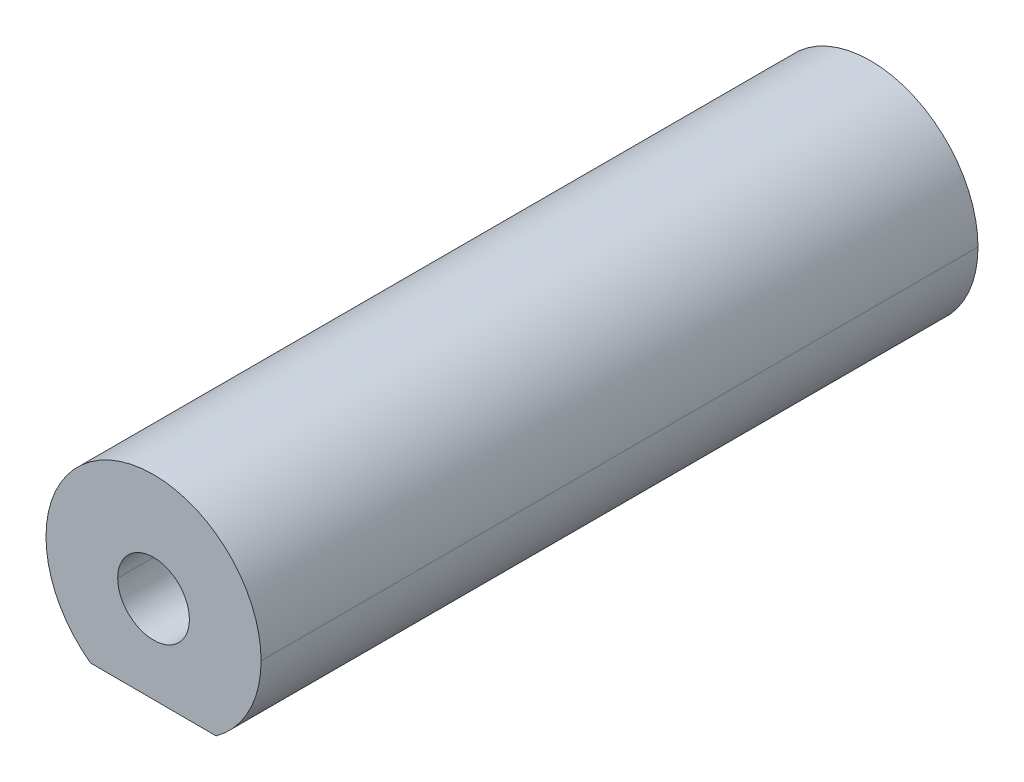
ISO-10303-21;
HEADER;
FILE_DESCRIPTION(('STEP AP214'),'2;1');
FILE_NAME('part.step','',(''),(''),'','','');
FILE_SCHEMA(('AUTOMOTIVE_DESIGN { 1 0 10303 214 1 1 1 1 }'));
ENDSEC;
DATA;
#1=APPLICATION_CONTEXT('core data for automotive mechanical design processes');
#2=APPLICATION_PROTOCOL_DEFINITION('international standard','automotive_design',2000,#1);
#3=PRODUCT_CONTEXT('',#1,'mechanical');
#4=PRODUCT('Part','Part','',(#3));
#5=PRODUCT_RELATED_PRODUCT_CATEGORY('part','',(#4));
#6=PRODUCT_DEFINITION_FORMATION('','',#4);
#7=PRODUCT_DEFINITION_CONTEXT('part definition',#1,'design');
#8=PRODUCT_DEFINITION('design','',#6,#7);
#9=PRODUCT_DEFINITION_SHAPE('','',#8);
#10=(LENGTH_UNIT() NAMED_UNIT(*) SI_UNIT(.MILLI.,.METRE.));
#11=(NAMED_UNIT(*) PLANE_ANGLE_UNIT() SI_UNIT($,.RADIAN.));
#12=(NAMED_UNIT(*) SI_UNIT($,.STERADIAN.) SOLID_ANGLE_UNIT());
#13=UNCERTAINTY_MEASURE_WITH_UNIT(LENGTH_MEASURE(1.E-05),#10,'distance_accuracy_value','');
#14=(GEOMETRIC_REPRESENTATION_CONTEXT(3) GLOBAL_UNCERTAINTY_ASSIGNED_CONTEXT((#13)) GLOBAL_UNIT_ASSIGNED_CONTEXT((#10,
#11,#12)) REPRESENTATION_CONTEXT('',''));
#15=CARTESIAN_POINT('',(0.,0.,0.));
#16=DIRECTION('',(0.,0.,1.));
#17=DIRECTION('',(1.,0.,0.));
#18=AXIS2_PLACEMENT_3D('',#15,#16,#17);
#19=CARTESIAN_POINT('',(0.,0.,40.));
#20=DIRECTION('',(0.,0.,-1.));
#21=DIRECTION('',(-1.,0.,0.));
#22=AXIS2_PLACEMENT_3D('',#19,#20,#21);
#23=CYLINDRICAL_SURFACE('',#22,2.);
#24=DIRECTION('',(0.,0.,-1.));
#25=VECTOR('',#24,1.);
#26=CARTESIAN_POINT('',(2.,0.,40.));
#27=LINE('',#26,#25);
#28=CARTESIAN_POINT('',(2.,0.,40.));
#29=VERTEX_POINT('',#28);
#30=CARTESIAN_POINT('',(2.,0.,0.));
#31=VERTEX_POINT('',#30);
#32=EDGE_CURVE('E156',#29,#31,#27,.T.);
#33=ORIENTED_EDGE('',*,*,#32,.F.);
#34=CARTESIAN_POINT('',(0.,0.,40.));
#35=DIRECTION('',(0.,0.,1.));
#36=DIRECTION('',(1.,0.,0.));
#37=AXIS2_PLACEMENT_3D('',#34,#35,#36);
#38=CIRCLE('',#37,2.);
#39=CARTESIAN_POINT('',(-2.,0.,40.));
#40=VERTEX_POINT('',#39);
#41=EDGE_CURVE('E166',#29,#40,#38,.T.);
#42=ORIENTED_EDGE('',*,*,#41,.T.);
#43=DIRECTION('',(0.,0.,-1.));
#44=VECTOR('',#43,1.);
#45=CARTESIAN_POINT('',(-2.,0.,40.));
#46=LINE('',#45,#44);
#47=CARTESIAN_POINT('',(-2.,0.,0.));
#48=VERTEX_POINT('',#47);
#49=EDGE_CURVE('E128',#40,#48,#46,.T.);
#50=ORIENTED_EDGE('',*,*,#49,.T.);
#51=CARTESIAN_POINT('',(0.,0.,0.));
#52=DIRECTION('',(0.,0.,1.));
#53=DIRECTION('',(1.,0.,0.));
#54=AXIS2_PLACEMENT_3D('',#51,#52,#53);
#55=CIRCLE('',#54,2.);
#56=EDGE_CURVE('E61',#31,#48,#55,.T.);
#57=ORIENTED_EDGE('',*,*,#56,.F.);
#58=EDGE_LOOP('',(#33,#42,#50,#57));
#59=FACE_BOUND('',#58,.T.);
#60=ADVANCED_FACE('F50',(#59),#23,.F.);
#61=CARTESIAN_POINT('',(-3.51456884829359,-4.86290096656351,40.));
#62=DIRECTION('',(0.0029926806811827,0.999995521921144,0.));
#63=DIRECTION('',(0.,0.,-1.));
#64=AXIS2_PLACEMENT_3D('',#61,#62,#63);
#65=PLANE('',#64);
#66=DIRECTION('',(0.999995521921144,-0.0029926806811827,0.));
#67=VECTOR('',#66,1.);
#68=CARTESIAN_POINT('',(-3.51456884829359,-4.86290096656351,0.));
#69=LINE('',#68,#67);
#70=CARTESIAN_POINT('',(-3.51456884829359,-4.86290096656351,0.));
#71=VERTEX_POINT('',#70);
#72=CARTESIAN_POINT('',(3.48539980515442,-4.88384973133179,0.));
#73=VERTEX_POINT('',#72);
#74=EDGE_CURVE('E171',#71,#73,#69,.T.);
#75=ORIENTED_EDGE('',*,*,#74,.T.);
#76=DIRECTION('',(0.,0.,-1.));
#77=VECTOR('',#76,1.);
#78=CARTESIAN_POINT('',(3.48539980515442,-4.88384973133179,40.));
#79=LINE('',#78,#77);
#80=CARTESIAN_POINT('',(3.48539980515442,-4.88384973133179,40.));
#81=VERTEX_POINT('',#80);
#82=EDGE_CURVE('E11',#81,#73,#79,.T.);
#83=ORIENTED_EDGE('',*,*,#82,.F.);
#84=DIRECTION('',(0.999995521921144,-0.0029926806811827,0.));
#85=VECTOR('',#84,1.);
#86=CARTESIAN_POINT('',(-3.51456884829359,-4.86290096656351,40.));
#87=LINE('',#86,#85);
#88=CARTESIAN_POINT('',(-3.51456884829359,-4.86290096656351,40.));
#89=VERTEX_POINT('',#88);
#90=EDGE_CURVE('E134',#89,#81,#87,.T.);
#91=ORIENTED_EDGE('',*,*,#90,.F.);
#92=DIRECTION('',(0.,0.,-1.));
#93=VECTOR('',#92,1.);
#94=CARTESIAN_POINT('',(-3.51456884829359,-4.86290096656351,40.));
#95=LINE('',#94,#93);
#96=EDGE_CURVE('E138',#89,#71,#95,.T.);
#97=ORIENTED_EDGE('',*,*,#96,.T.);
#98=EDGE_LOOP('',(#75,#83,#91,#97));
#99=FACE_BOUND('',#98,.T.);
#100=ADVANCED_FACE('F52',(#99),#65,.F.);
#101=CARTESIAN_POINT('',(0.,0.,40.));
#102=DIRECTION('',(0.,0.,-1.));
#103=DIRECTION('',(-1.,0.,0.));
#104=AXIS2_PLACEMENT_3D('',#101,#102,#103);
#105=CYLINDRICAL_SURFACE('',#104,6.);
#106=DIRECTION('',(0.,0.,-1.));
#107=VECTOR('',#106,1.);
#108=CARTESIAN_POINT('',(6.,0.,40.));
#109=LINE('',#108,#107);
#110=CARTESIAN_POINT('',(6.,0.,40.));
#111=VERTEX_POINT('',#110);
#112=CARTESIAN_POINT('',(6.,0.,0.));
#113=VERTEX_POINT('',#112);
#114=EDGE_CURVE('E123',#111,#113,#109,.T.);
#115=ORIENTED_EDGE('',*,*,#114,.F.);
#116=CARTESIAN_POINT('',(0.,0.,40.));
#117=DIRECTION('',(0.,0.,1.));
#118=DIRECTION('',(1.,0.,0.));
#119=AXIS2_PLACEMENT_3D('',#116,#117,#118);
#120=CIRCLE('',#119,6.);
#121=EDGE_CURVE('E131',#81,#111,#120,.T.);
#122=ORIENTED_EDGE('',*,*,#121,.F.);
#123=ORIENTED_EDGE('',*,*,#82,.T.);
#124=CARTESIAN_POINT('',(0.,0.,0.));
#125=DIRECTION('',(0.,0.,1.));
#126=DIRECTION('',(1.,0.,0.));
#127=AXIS2_PLACEMENT_3D('',#124,#125,#126);
#128=CIRCLE('',#127,6.);
#129=EDGE_CURVE('E75',#73,#113,#128,.T.);
#130=ORIENTED_EDGE('',*,*,#129,.T.);
#131=EDGE_LOOP('',(#115,#122,#123,#130));
#132=FACE_BOUND('',#131,.T.);
#133=ADVANCED_FACE('F140',(#132),#105,.T.);
#134=CARTESIAN_POINT('',(0.,0.,0.));
#135=DIRECTION('',(0.,0.,1.));
#136=DIRECTION('',(1.,0.,0.));
#137=AXIS2_PLACEMENT_3D('',#134,#135,#136);
#138=PLANE('',#137);
#139=CARTESIAN_POINT('',(0.,0.,0.));
#140=DIRECTION('',(0.,0.,1.));
#141=DIRECTION('',(1.,0.,0.));
#142=AXIS2_PLACEMENT_3D('',#139,#140,#141);
#143=CIRCLE('',#142,2.);
#144=EDGE_CURVE('E150',#48,#31,#143,.T.);
#145=ORIENTED_EDGE('',*,*,#144,.T.);
#146=ORIENTED_EDGE('',*,*,#56,.T.);
#147=EDGE_LOOP('',(#145,#146));
#148=FACE_BOUND('',#147,.T.);
#149=ORIENTED_EDGE('',*,*,#129,.F.);
#150=ORIENTED_EDGE('',*,*,#74,.F.);
#151=CARTESIAN_POINT('',(0.,0.,0.));
#152=DIRECTION('',(0.,0.,1.));
#153=DIRECTION('',(1.,0.,0.));
#154=AXIS2_PLACEMENT_3D('',#151,#152,#153);
#155=CIRCLE('',#154,6.);
#156=CARTESIAN_POINT('',(-6.,0.,0.));
#157=VERTEX_POINT('',#156);
#158=EDGE_CURVE('E155',#157,#71,#155,.T.);
#159=ORIENTED_EDGE('',*,*,#158,.F.);
#160=CARTESIAN_POINT('',(0.,0.,0.));
#161=DIRECTION('',(0.,0.,1.));
#162=DIRECTION('',(1.,0.,0.));
#163=AXIS2_PLACEMENT_3D('',#160,#161,#162);
#164=CIRCLE('',#163,6.);
#165=EDGE_CURVE('E142',#113,#157,#164,.T.);
#166=ORIENTED_EDGE('',*,*,#165,.F.);
#167=EDGE_LOOP('',(#149,#150,#159,#166));
#168=FACE_BOUND('',#167,.T.);
#169=ADVANCED_FACE('F194',(#148,#168),#138,.F.);
#170=CARTESIAN_POINT('',(0.,0.,40.));
#171=DIRECTION('',(0.,0.,1.));
#172=DIRECTION('',(1.,0.,0.));
#173=AXIS2_PLACEMENT_3D('',#170,#171,#172);
#174=PLANE('',#173);
#175=CARTESIAN_POINT('',(0.,0.,40.));
#176=DIRECTION('',(0.,0.,1.));
#177=DIRECTION('',(1.,0.,0.));
#178=AXIS2_PLACEMENT_3D('',#175,#176,#177);
#179=CIRCLE('',#178,2.);
#180=EDGE_CURVE('E54',#40,#29,#179,.T.);
#181=ORIENTED_EDGE('',*,*,#180,.F.);
#182=ORIENTED_EDGE('',*,*,#41,.F.);
#183=EDGE_LOOP('',(#181,#182));
#184=FACE_BOUND('',#183,.T.);
#185=ORIENTED_EDGE('',*,*,#121,.T.);
#186=CARTESIAN_POINT('',(0.,0.,40.));
#187=DIRECTION('',(0.,0.,1.));
#188=DIRECTION('',(1.,0.,0.));
#189=AXIS2_PLACEMENT_3D('',#186,#187,#188);
#190=CIRCLE('',#189,6.);
#191=CARTESIAN_POINT('',(-6.,0.,40.));
#192=VERTEX_POINT('',#191);
#193=EDGE_CURVE('E118',#111,#192,#190,.T.);
#194=ORIENTED_EDGE('',*,*,#193,.T.);
#195=CARTESIAN_POINT('',(0.,0.,40.));
#196=DIRECTION('',(0.,0.,1.));
#197=DIRECTION('',(1.,0.,0.));
#198=AXIS2_PLACEMENT_3D('',#195,#196,#197);
#199=CIRCLE('',#198,6.);
#200=EDGE_CURVE('E162',#192,#89,#199,.T.);
#201=ORIENTED_EDGE('',*,*,#200,.T.);
#202=ORIENTED_EDGE('',*,*,#90,.T.);
#203=EDGE_LOOP('',(#185,#194,#201,#202));
#204=FACE_BOUND('',#203,.T.);
#205=ADVANCED_FACE('F132',(#184,#204),#174,.T.);
#206=CARTESIAN_POINT('',(0.,0.,40.));
#207=DIRECTION('',(0.,0.,-1.));
#208=DIRECTION('',(-1.,0.,0.));
#209=AXIS2_PLACEMENT_3D('',#206,#207,#208);
#210=CYLINDRICAL_SURFACE('',#209,6.);
#211=ORIENTED_EDGE('',*,*,#200,.F.);
#212=DIRECTION('',(0.,0.,-1.));
#213=VECTOR('',#212,1.);
#214=CARTESIAN_POINT('',(-6.,0.,40.));
#215=LINE('',#214,#213);
#216=EDGE_CURVE('E124',#192,#157,#215,.T.);
#217=ORIENTED_EDGE('',*,*,#216,.T.);
#218=ORIENTED_EDGE('',*,*,#158,.T.);
#219=ORIENTED_EDGE('',*,*,#96,.F.);
#220=EDGE_LOOP('',(#211,#217,#218,#219));
#221=FACE_BOUND('',#220,.T.);
#222=ADVANCED_FACE('F227',(#221),#210,.T.);
#223=CARTESIAN_POINT('',(0.,0.,40.));
#224=DIRECTION('',(0.,0.,-1.));
#225=DIRECTION('',(-1.,0.,0.));
#226=AXIS2_PLACEMENT_3D('',#223,#224,#225);
#227=CYLINDRICAL_SURFACE('',#226,6.);
#228=ORIENTED_EDGE('',*,*,#193,.F.);
#229=ORIENTED_EDGE('',*,*,#114,.T.);
#230=ORIENTED_EDGE('',*,*,#165,.T.);
#231=ORIENTED_EDGE('',*,*,#216,.F.);
#232=EDGE_LOOP('',(#228,#229,#230,#231));
#233=FACE_BOUND('',#232,.T.);
#234=ADVANCED_FACE('F120',(#233),#227,.T.);
#235=CARTESIAN_POINT('',(0.,0.,40.));
#236=DIRECTION('',(0.,0.,-1.));
#237=DIRECTION('',(-1.,0.,0.));
#238=AXIS2_PLACEMENT_3D('',#235,#236,#237);
#239=CYLINDRICAL_SURFACE('',#238,2.);
#240=ORIENTED_EDGE('',*,*,#180,.T.);
#241=ORIENTED_EDGE('',*,*,#32,.T.);
#242=ORIENTED_EDGE('',*,*,#144,.F.);
#243=ORIENTED_EDGE('',*,*,#49,.F.);
#244=EDGE_LOOP('',(#240,#241,#242,#243));
#245=FACE_BOUND('',#244,.T.);
#246=ADVANCED_FACE('F198',(#245),#239,.F.);
#247=CLOSED_SHELL('',(#60,#100,#133,#169,#205,#222,#234,#246));
#248=MANIFOLD_SOLID_BREP('B2',#247);
#249=ADVANCED_BREP_SHAPE_REPRESENTATION('',(#18,#248),#14);
#250=SHAPE_DEFINITION_REPRESENTATION(#9,#249);
ENDSEC;
END-ISO-10303-21;
